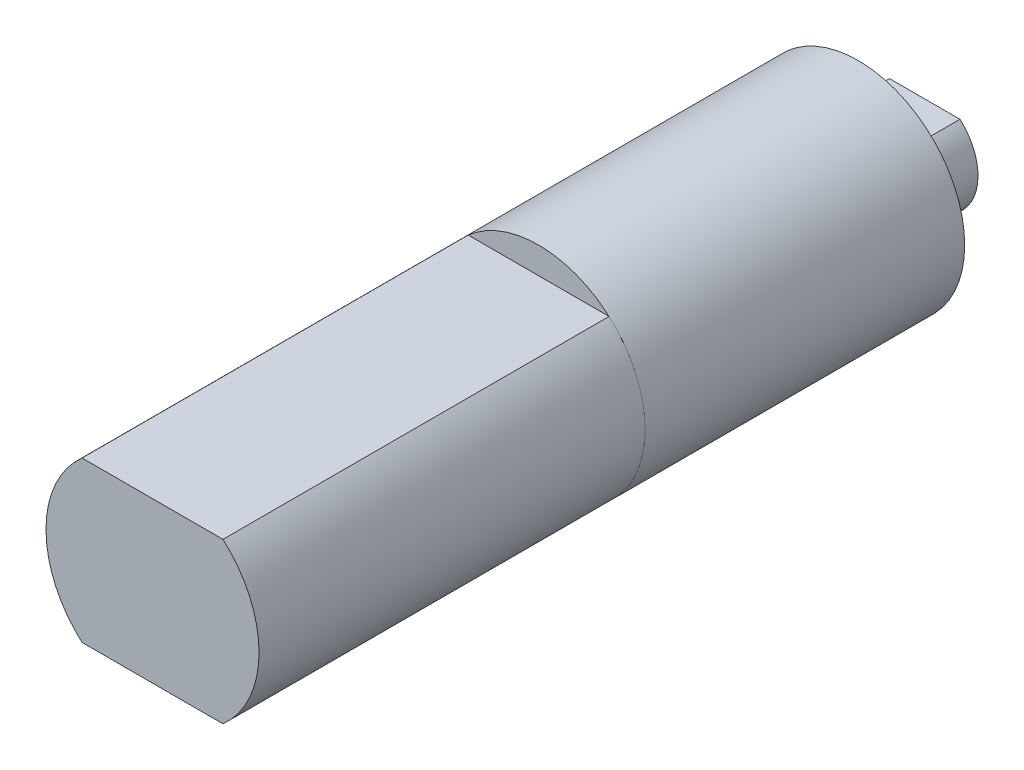
ISO-10303-21;
HEADER;
FILE_DESCRIPTION(('STEP AP214'),'2;1');
FILE_NAME('part.step','',(''),(''),'','','');
FILE_SCHEMA(('AUTOMOTIVE_DESIGN { 1 0 10303 214 1 1 1 1 }'));
ENDSEC;
DATA;
#1=APPLICATION_CONTEXT('core data for automotive mechanical design processes');
#2=APPLICATION_PROTOCOL_DEFINITION('international standard','automotive_design',2000,#1);
#3=PRODUCT_CONTEXT('',#1,'mechanical');
#4=PRODUCT('Part','Part','',(#3));
#5=PRODUCT_RELATED_PRODUCT_CATEGORY('part','',(#4));
#6=PRODUCT_DEFINITION_FORMATION('','',#4);
#7=PRODUCT_DEFINITION_CONTEXT('part definition',#1,'design');
#8=PRODUCT_DEFINITION('design','',#6,#7);
#9=PRODUCT_DEFINITION_SHAPE('','',#8);
#10=(LENGTH_UNIT() NAMED_UNIT(*) SI_UNIT(.MILLI.,.METRE.));
#11=(NAMED_UNIT(*) PLANE_ANGLE_UNIT() SI_UNIT($,.RADIAN.));
#12=(NAMED_UNIT(*) SI_UNIT($,.STERADIAN.) SOLID_ANGLE_UNIT());
#13=UNCERTAINTY_MEASURE_WITH_UNIT(LENGTH_MEASURE(1.E-05),#10,'distance_accuracy_value','');
#14=(GEOMETRIC_REPRESENTATION_CONTEXT(3) GLOBAL_UNCERTAINTY_ASSIGNED_CONTEXT((#13)) GLOBAL_UNIT_ASSIGNED_CONTEXT((#10,
#11,#12)) REPRESENTATION_CONTEXT('',''));
#15=CARTESIAN_POINT('',(0.,0.,0.));
#16=DIRECTION('',(0.,0.,1.));
#17=DIRECTION('',(1.,0.,0.));
#18=AXIS2_PLACEMENT_3D('',#15,#16,#17);
#19=CARTESIAN_POINT('',(0.,0.,26.5));
#20=DIRECTION('',(0.,0.,-1.));
#21=DIRECTION('',(-1.,0.,0.));
#22=AXIS2_PLACEMENT_3D('',#19,#20,#21);
#23=CYLINDRICAL_SURFACE('',#22,4.);
#24=CARTESIAN_POINT('',(0.,0.,12.));
#25=DIRECTION('',(0.,0.,1.));
#26=DIRECTION('',(1.,0.,0.));
#27=AXIS2_PLACEMENT_3D('',#24,#25,#26);
#28=CIRCLE('',#27,4.);
#29=CARTESIAN_POINT('',(2.64575131106459,-3.,12.));
#30=VERTEX_POINT('',#29);
#31=CARTESIAN_POINT('',(2.64575131106459,3.,12.));
#32=VERTEX_POINT('',#31);
#33=EDGE_CURVE('E109',#30,#32,#28,.T.);
#34=ORIENTED_EDGE('',*,*,#33,.T.);
#35=DIRECTION('',(0.,0.,-1.));
#36=VECTOR('',#35,1.);
#37=CARTESIAN_POINT('',(2.64575131106459,3.,26.5));
#38=LINE('',#37,#36);
#39=CARTESIAN_POINT('',(2.64575131106459,3.,26.5));
#40=VERTEX_POINT('',#39);
#41=EDGE_CURVE('E12',#40,#32,#38,.T.);
#42=ORIENTED_EDGE('',*,*,#41,.F.);
#43=CARTESIAN_POINT('',(0.,0.,26.5));
#44=DIRECTION('',(0.,0.,1.));
#45=DIRECTION('',(1.,0.,0.));
#46=AXIS2_PLACEMENT_3D('',#43,#44,#45);
#47=CIRCLE('',#46,4.);
#48=CARTESIAN_POINT('',(2.64575131106459,-3.,26.5));
#49=VERTEX_POINT('',#48);
#50=EDGE_CURVE('E97',#49,#40,#47,.T.);
#51=ORIENTED_EDGE('',*,*,#50,.F.);
#52=DIRECTION('',(0.,0.,-1.));
#53=VECTOR('',#52,1.);
#54=CARTESIAN_POINT('',(2.64575131106459,-3.,26.5));
#55=LINE('',#54,#53);
#56=EDGE_CURVE('E105',#49,#30,#55,.T.);
#57=ORIENTED_EDGE('',*,*,#56,.T.);
#58=EDGE_LOOP('',(#34,#42,#51,#57));
#59=FACE_BOUND('',#58,.T.);
#60=ADVANCED_FACE('F46',(#59),#23,.T.);
#61=CARTESIAN_POINT('',(-2.64575131106459,3.,26.5));
#62=DIRECTION('',(0.,-1.,0.));
#63=DIRECTION('',(0.,0.,-1.));
#64=AXIS2_PLACEMENT_3D('',#61,#62,#63);
#65=PLANE('',#64);
#66=DIRECTION('',(-1.,0.,0.));
#67=VECTOR('',#66,1.);
#68=CARTESIAN_POINT('',(-2.64575131106459,3.,12.));
#69=LINE('',#68,#67);
#70=CARTESIAN_POINT('',(-2.64575131106459,3.,12.));
#71=VERTEX_POINT('',#70);
#72=EDGE_CURVE('E101',#32,#71,#69,.T.);
#73=ORIENTED_EDGE('',*,*,#72,.T.);
#74=DIRECTION('',(0.,0.,-1.));
#75=VECTOR('',#74,1.);
#76=CARTESIAN_POINT('',(-2.64575131106459,3.,26.5));
#77=LINE('',#76,#75);
#78=CARTESIAN_POINT('',(-2.64575131106459,3.,26.5));
#79=VERTEX_POINT('',#78);
#80=EDGE_CURVE('E54',#79,#71,#77,.T.);
#81=ORIENTED_EDGE('',*,*,#80,.F.);
#82=DIRECTION('',(-1.,0.,0.));
#83=VECTOR('',#82,1.);
#84=CARTESIAN_POINT('',(-2.64575131106459,3.,26.5));
#85=LINE('',#84,#83);
#86=EDGE_CURVE('E92',#40,#79,#85,.T.);
#87=ORIENTED_EDGE('',*,*,#86,.F.);
#88=ORIENTED_EDGE('',*,*,#41,.T.);
#89=EDGE_LOOP('',(#73,#81,#87,#88));
#90=FACE_BOUND('',#89,.T.);
#91=ADVANCED_FACE('F100',(#90),#65,.F.);
#92=CARTESIAN_POINT('',(0.,0.,26.5));
#93=DIRECTION('',(0.,0.,-1.));
#94=DIRECTION('',(-1.,0.,0.));
#95=AXIS2_PLACEMENT_3D('',#92,#93,#94);
#96=CYLINDRICAL_SURFACE('',#95,4.);
#97=CARTESIAN_POINT('',(0.,0.,12.));
#98=DIRECTION('',(0.,0.,1.));
#99=DIRECTION('',(1.,0.,0.));
#100=AXIS2_PLACEMENT_3D('',#97,#98,#99);
#101=CIRCLE('',#100,4.);
#102=CARTESIAN_POINT('',(-2.64575131106459,-3.,12.));
#103=VERTEX_POINT('',#102);
#104=EDGE_CURVE('E79',#71,#103,#101,.T.);
#105=ORIENTED_EDGE('',*,*,#104,.T.);
#106=DIRECTION('',(0.,0.,-1.));
#107=VECTOR('',#106,1.);
#108=CARTESIAN_POINT('',(-2.64575131106459,-3.,26.5));
#109=LINE('',#108,#107);
#110=CARTESIAN_POINT('',(-2.64575131106459,-3.,26.5));
#111=VERTEX_POINT('',#110);
#112=EDGE_CURVE('E102',#111,#103,#109,.T.);
#113=ORIENTED_EDGE('',*,*,#112,.F.);
#114=CARTESIAN_POINT('',(0.,0.,26.5));
#115=DIRECTION('',(0.,0.,1.));
#116=DIRECTION('',(1.,0.,0.));
#117=AXIS2_PLACEMENT_3D('',#114,#115,#116);
#118=CIRCLE('',#117,4.);
#119=EDGE_CURVE('E95',#79,#111,#118,.T.);
#120=ORIENTED_EDGE('',*,*,#119,.F.);
#121=ORIENTED_EDGE('',*,*,#80,.T.);
#122=EDGE_LOOP('',(#105,#113,#120,#121));
#123=FACE_BOUND('',#122,.T.);
#124=ADVANCED_FACE('F103',(#123),#96,.T.);
#125=CARTESIAN_POINT('',(-2.64575131106459,-3.,26.5));
#126=DIRECTION('',(0.,1.,0.));
#127=DIRECTION('',(0.,0.,1.));
#128=AXIS2_PLACEMENT_3D('',#125,#126,#127);
#129=PLANE('',#128);
#130=DIRECTION('',(1.,0.,0.));
#131=VECTOR('',#130,1.);
#132=CARTESIAN_POINT('',(-2.64575131106459,-3.,12.));
#133=LINE('',#132,#131);
#134=EDGE_CURVE('E85',#103,#30,#133,.T.);
#135=ORIENTED_EDGE('',*,*,#134,.T.);
#136=ORIENTED_EDGE('',*,*,#56,.F.);
#137=DIRECTION('',(1.,0.,0.));
#138=VECTOR('',#137,1.);
#139=CARTESIAN_POINT('',(-2.64575131106459,-3.,26.5));
#140=LINE('',#139,#138);
#141=EDGE_CURVE('E62',#111,#49,#140,.T.);
#142=ORIENTED_EDGE('',*,*,#141,.F.);
#143=ORIENTED_EDGE('',*,*,#112,.T.);
#144=EDGE_LOOP('',(#135,#136,#142,#143));
#145=FACE_BOUND('',#144,.T.);
#146=ADVANCED_FACE('F116',(#145),#129,.F.);
#147=CARTESIAN_POINT('',(0.,0.,26.5));
#148=DIRECTION('',(0.,0.,1.));
#149=DIRECTION('',(1.,0.,0.));
#150=AXIS2_PLACEMENT_3D('',#147,#148,#149);
#151=PLANE('',#150);
#152=ORIENTED_EDGE('',*,*,#50,.T.);
#153=ORIENTED_EDGE('',*,*,#86,.T.);
#154=ORIENTED_EDGE('',*,*,#119,.T.);
#155=ORIENTED_EDGE('',*,*,#141,.T.);
#156=EDGE_LOOP('',(#152,#153,#154,#155));
#157=FACE_BOUND('',#156,.T.);
#158=ADVANCED_FACE('F93',(#157),#151,.T.);
#159=CARTESIAN_POINT('',(0.,0.,12.));
#160=DIRECTION('',(0.,0.,1.));
#161=DIRECTION('',(1.,0.,0.));
#162=AXIS2_PLACEMENT_3D('',#159,#160,#161);
#163=PLANE('',#162);
#164=ORIENTED_EDGE('',*,*,#33,.F.);
#165=ORIENTED_EDGE('',*,*,#134,.F.);
#166=ORIENTED_EDGE('',*,*,#104,.F.);
#167=ORIENTED_EDGE('',*,*,#72,.F.);
#168=EDGE_LOOP('',(#164,#165,#166,#167));
#169=FACE_BOUND('',#168,.T.);
#170=ADVANCED_FACE('F119',(#169),#163,.F.);
#171=CLOSED_SHELL('',(#60,#91,#124,#146,#158,#170));
#172=MANIFOLD_SOLID_BREP('B2',#171);
#173=CARTESIAN_POINT('',(0.,0.,12.));
#174=DIRECTION('',(0.,0.,-1.));
#175=DIRECTION('',(-1.,0.,0.));
#176=AXIS2_PLACEMENT_3D('',#173,#174,#175);
#177=CYLINDRICAL_SURFACE('',#176,4.);
#178=CARTESIAN_POINT('',(0.,0.,12.));
#179=DIRECTION('',(0.,0.,1.));
#180=DIRECTION('',(1.,0.,0.));
#181=AXIS2_PLACEMENT_3D('',#178,#179,#180);
#182=CIRCLE('',#181,4.);
#183=CARTESIAN_POINT('',(4.,0.,12.));
#184=VERTEX_POINT('',#183);
#185=EDGE_CURVE('E44',#184,#184,#182,.T.);
#186=ORIENTED_EDGE('',*,*,#185,.F.);
#187=EDGE_LOOP('',(#186));
#188=FACE_BOUND('',#187,.T.);
#189=CARTESIAN_POINT('',(0.,0.,0.));
#190=DIRECTION('',(0.,0.,1.));
#191=DIRECTION('',(1.,0.,0.));
#192=AXIS2_PLACEMENT_3D('',#189,#190,#191);
#193=CIRCLE('',#192,4.);
#194=CARTESIAN_POINT('',(4.,0.,0.));
#195=VERTEX_POINT('',#194);
#196=EDGE_CURVE('E172',#195,#195,#193,.T.);
#197=ORIENTED_EDGE('',*,*,#196,.T.);
#198=EDGE_LOOP('',(#197));
#199=FACE_BOUND('',#198,.T.);
#200=ADVANCED_FACE('F169',(#188,#199),#177,.T.);
#201=CARTESIAN_POINT('',(0.,0.,12.));
#202=DIRECTION('',(0.,0.,1.));
#203=DIRECTION('',(1.,0.,0.));
#204=AXIS2_PLACEMENT_3D('',#201,#202,#203);
#205=PLANE('',#204);
#206=ORIENTED_EDGE('',*,*,#185,.T.);
#207=EDGE_LOOP('',(#206));
#208=FACE_BOUND('',#207,.T.);
#209=ADVANCED_FACE('F217',(#208),#205,.T.);
#210=CARTESIAN_POINT('',(0.,0.,0.));
#211=DIRECTION('',(0.,0.,1.));
#212=DIRECTION('',(1.,0.,0.));
#213=AXIS2_PLACEMENT_3D('',#210,#211,#212);
#214=PLANE('',#213);
#215=CARTESIAN_POINT('',(0.,0.,0.));
#216=DIRECTION('',(0.,0.,1.));
#217=DIRECTION('',(1.,0.,0.));
#218=AXIS2_PLACEMENT_3D('',#215,#216,#217);
#219=CIRCLE('',#218,2.);
#220=CARTESIAN_POINT('',(-1.32287565553229,1.5,0.));
#221=VERTEX_POINT('',#220);
#222=CARTESIAN_POINT('',(1.32287565553229,1.5,0.));
#223=VERTEX_POINT('',#222);
#224=EDGE_CURVE('E205',#221,#223,#219,.T.);
#225=ORIENTED_EDGE('',*,*,#224,.T.);
#226=DIRECTION('',(-1.,0.,0.));
#227=VECTOR('',#226,1.);
#228=CARTESIAN_POINT('',(0.,1.5,0.));
#229=LINE('',#228,#227);
#230=EDGE_CURVE('E198',#223,#221,#229,.T.);
#231=ORIENTED_EDGE('',*,*,#230,.T.);
#232=EDGE_LOOP('',(#225,#231));
#233=FACE_BOUND('',#232,.T.);
#234=ORIENTED_EDGE('',*,*,#196,.F.);
#235=EDGE_LOOP('',(#234));
#236=FACE_BOUND('',#235,.T.);
#237=ADVANCED_FACE('F214',(#233,#236),#214,.F.);
#238=CARTESIAN_POINT('',(0.,0.,-2.5));
#239=DIRECTION('',(0.,0.,1.));
#240=DIRECTION('',(1.,0.,0.));
#241=AXIS2_PLACEMENT_3D('',#238,#239,#240);
#242=CYLINDRICAL_SURFACE('',#241,2.);
#243=DIRECTION('',(0.,0.,-1.));
#244=VECTOR('',#243,1.);
#245=CARTESIAN_POINT('',(1.32287565553229,1.5,0.));
#246=LINE('',#245,#244);
#247=CARTESIAN_POINT('',(1.32287565553229,1.5,-2.5));
#248=VERTEX_POINT('',#247);
#249=EDGE_CURVE('E183',#223,#248,#246,.T.);
#250=ORIENTED_EDGE('',*,*,#249,.F.);
#251=ORIENTED_EDGE('',*,*,#224,.F.);
#252=DIRECTION('',(0.,0.,-1.));
#253=VECTOR('',#252,1.);
#254=CARTESIAN_POINT('',(-1.32287565553229,1.5,0.));
#255=LINE('',#254,#253);
#256=CARTESIAN_POINT('',(-1.32287565553229,1.5,-2.5));
#257=VERTEX_POINT('',#256);
#258=EDGE_CURVE('E189',#221,#257,#255,.T.);
#259=ORIENTED_EDGE('',*,*,#258,.T.);
#260=CARTESIAN_POINT('',(0.,0.,-2.5));
#261=DIRECTION('',(0.,0.,1.));
#262=DIRECTION('',(1.,0.,0.));
#263=AXIS2_PLACEMENT_3D('',#260,#261,#262);
#264=CIRCLE('',#263,2.);
#265=EDGE_CURVE('E203',#257,#248,#264,.T.);
#266=ORIENTED_EDGE('',*,*,#265,.T.);
#267=EDGE_LOOP('',(#250,#251,#259,#266));
#268=FACE_BOUND('',#267,.T.);
#269=ADVANCED_FACE('F202',(#268),#242,.T.);
#270=CARTESIAN_POINT('',(0.,0.,-2.5));
#271=DIRECTION('',(0.,0.,1.));
#272=DIRECTION('',(1.,0.,0.));
#273=AXIS2_PLACEMENT_3D('',#270,#271,#272);
#274=PLANE('',#273);
#275=ORIENTED_EDGE('',*,*,#265,.F.);
#276=DIRECTION('',(-1.,0.,0.));
#277=VECTOR('',#276,1.);
#278=CARTESIAN_POINT('',(0.,1.5,-2.5));
#279=LINE('',#278,#277);
#280=EDGE_CURVE('E193',#248,#257,#279,.T.);
#281=ORIENTED_EDGE('',*,*,#280,.F.);
#282=EDGE_LOOP('',(#275,#281));
#283=FACE_BOUND('',#282,.T.);
#284=ADVANCED_FACE('F207',(#283),#274,.F.);
#285=CARTESIAN_POINT('',(0.,1.5,0.));
#286=DIRECTION('',(0.,-1.,0.));
#287=DIRECTION('',(0.,0.,-1.));
#288=AXIS2_PLACEMENT_3D('',#285,#286,#287);
#289=PLANE('',#288);
#290=ORIENTED_EDGE('',*,*,#280,.T.);
#291=ORIENTED_EDGE('',*,*,#258,.F.);
#292=ORIENTED_EDGE('',*,*,#230,.F.);
#293=ORIENTED_EDGE('',*,*,#249,.T.);
#294=EDGE_LOOP('',(#290,#291,#292,#293));
#295=FACE_BOUND('',#294,.T.);
#296=ADVANCED_FACE('F194',(#295),#289,.F.);
#297=CLOSED_SHELL('',(#200,#209,#237,#269,#284,#296));
#298=MANIFOLD_SOLID_BREP('B6',#297);
#299=ADVANCED_BREP_SHAPE_REPRESENTATION('',(#18,#172,#298),#14);
#300=SHAPE_DEFINITION_REPRESENTATION(#9,#299);
ENDSEC;
END-ISO-10303-21;
